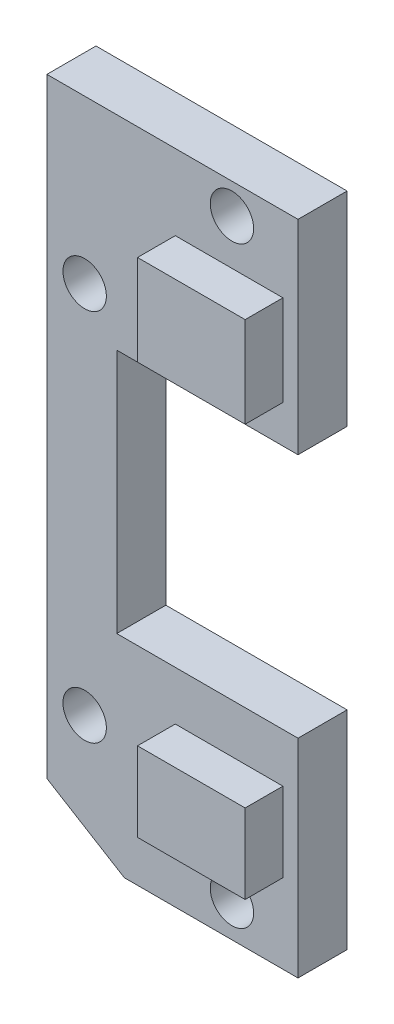
ISO-10303-21;
HEADER;
FILE_DESCRIPTION(('STEP AP214'),'2;1');
FILE_NAME('part.step','',(''),(''),'','','');
FILE_SCHEMA(('AUTOMOTIVE_DESIGN { 1 0 10303 214 1 1 1 1 }'));
ENDSEC;
DATA;
#1=APPLICATION_CONTEXT('core data for automotive mechanical design processes');
#2=APPLICATION_PROTOCOL_DEFINITION('international standard','automotive_design',2000,#1);
#3=PRODUCT_CONTEXT('',#1,'mechanical');
#4=PRODUCT('Part','Part','',(#3));
#5=PRODUCT_RELATED_PRODUCT_CATEGORY('part','',(#4));
#6=PRODUCT_DEFINITION_FORMATION('','',#4);
#7=PRODUCT_DEFINITION_CONTEXT('part definition',#1,'design');
#8=PRODUCT_DEFINITION('design','',#6,#7);
#9=PRODUCT_DEFINITION_SHAPE('','',#8);
#10=(LENGTH_UNIT() NAMED_UNIT(*) SI_UNIT(.MILLI.,.METRE.));
#11=(NAMED_UNIT(*) PLANE_ANGLE_UNIT() SI_UNIT($,.RADIAN.));
#12=(NAMED_UNIT(*) SI_UNIT($,.STERADIAN.) SOLID_ANGLE_UNIT());
#13=UNCERTAINTY_MEASURE_WITH_UNIT(LENGTH_MEASURE(1.E-05),#10,'distance_accuracy_value','');
#14=(GEOMETRIC_REPRESENTATION_CONTEXT(3) GLOBAL_UNCERTAINTY_ASSIGNED_CONTEXT((#13)) GLOBAL_UNIT_ASSIGNED_CONTEXT((#10,
#11,#12)) REPRESENTATION_CONTEXT('',''));
#15=CARTESIAN_POINT('',(0.,0.,0.));
#16=DIRECTION('',(0.,0.,1.));
#17=DIRECTION('',(1.,0.,0.));
#18=AXIS2_PLACEMENT_3D('',#15,#16,#17);
#19=CARTESIAN_POINT('',(0.,0.,2.6));
#20=DIRECTION('',(0.,0.,1.));
#21=DIRECTION('',(1.,0.,0.));
#22=AXIS2_PLACEMENT_3D('',#19,#20,#21);
#23=PLANE('',#22);
#24=CARTESIAN_POINT('',(-29.,-22.2,2.6));
#25=DIRECTION('',(0.,0.,1.));
#26=DIRECTION('',(1.,0.,0.));
#27=AXIS2_PLACEMENT_3D('',#24,#25,#26);
#28=CIRCLE('',#27,1.15);
#29=CARTESIAN_POINT('',(-27.85,-22.2,2.6));
#30=VERTEX_POINT('',#29);
#31=EDGE_CURVE('E228',#30,#30,#28,.T.);
#32=ORIENTED_EDGE('',*,*,#31,.F.);
#33=EDGE_LOOP('',(#32));
#34=FACE_BOUND('',#33,.T.);
#35=CARTESIAN_POINT('',(-36.8,-17.6,2.6));
#36=DIRECTION('',(0.,0.,1.));
#37=DIRECTION('',(1.,0.,0.));
#38=AXIS2_PLACEMENT_3D('',#35,#36,#37);
#39=CIRCLE('',#38,1.15);
#40=CARTESIAN_POINT('',(-35.65,-17.6,2.6));
#41=VERTEX_POINT('',#40);
#42=EDGE_CURVE('E240',#41,#41,#39,.T.);
#43=ORIENTED_EDGE('',*,*,#42,.F.);
#44=EDGE_LOOP('',(#43));
#45=FACE_BOUND('',#44,.T.);
#46=DIRECTION('',(0.,-1.,0.));
#47=VECTOR('',#46,1.);
#48=CARTESIAN_POINT('',(-38.8,10.8,2.6));
#49=LINE('',#48,#47);
#50=CARTESIAN_POINT('',(-38.8,10.8,2.6));
#51=VERTEX_POINT('',#50);
#52=CARTESIAN_POINT('',(-38.8,-21.5,2.6));
#53=VERTEX_POINT('',#52);
#54=EDGE_CURVE('E246',#51,#53,#49,.T.);
#55=ORIENTED_EDGE('',*,*,#54,.T.);
#56=DIRECTION('',(0.853796175794035,-0.520607424264657,0.));
#57=VECTOR('',#56,1.);
#58=CARTESIAN_POINT('',(-38.8,-21.5,2.6));
#59=LINE('',#58,#57);
#60=CARTESIAN_POINT('',(-34.7,-24.,2.6));
#61=VERTEX_POINT('',#60);
#62=EDGE_CURVE('E249',#53,#61,#59,.T.);
#63=ORIENTED_EDGE('',*,*,#62,.T.);
#64=DIRECTION('',(1.,0.,0.));
#65=VECTOR('',#64,1.);
#66=CARTESIAN_POINT('',(-34.7,-24.,2.6));
#67=LINE('',#66,#65);
#68=CARTESIAN_POINT('',(-25.5,-24.,2.6));
#69=VERTEX_POINT('',#68);
#70=EDGE_CURVE('E252',#61,#69,#67,.T.);
#71=ORIENTED_EDGE('',*,*,#70,.T.);
#72=DIRECTION('',(0.,1.,0.));
#73=VECTOR('',#72,1.);
#74=CARTESIAN_POINT('',(-25.5,-24.,2.6));
#75=LINE('',#74,#73);
#76=CARTESIAN_POINT('',(-25.5,-13.,2.6));
#77=VERTEX_POINT('',#76);
#78=EDGE_CURVE('E254',#69,#77,#75,.T.);
#79=ORIENTED_EDGE('',*,*,#78,.T.);
#80=DIRECTION('',(-1.,0.,0.));
#81=VECTOR('',#80,1.);
#82=CARTESIAN_POINT('',(-25.5,-13.,2.6));
#83=LINE('',#82,#81);
#84=CARTESIAN_POINT('',(-35.1,-13.,2.6));
#85=VERTEX_POINT('',#84);
#86=EDGE_CURVE('E256',#77,#85,#83,.T.);
#87=ORIENTED_EDGE('',*,*,#86,.T.);
#88=DIRECTION('',(0.,1.,0.));
#89=VECTOR('',#88,1.);
#90=CARTESIAN_POINT('',(-35.1,-13.,2.6));
#91=LINE('',#90,#89);
#92=CARTESIAN_POINT('',(-35.1,0.,2.6));
#93=VERTEX_POINT('',#92);
#94=EDGE_CURVE('E258',#85,#93,#91,.T.);
#95=ORIENTED_EDGE('',*,*,#94,.T.);
#96=DIRECTION('',(1.,0.,0.));
#97=VECTOR('',#96,1.);
#98=CARTESIAN_POINT('',(-35.1,0.,2.6));
#99=LINE('',#98,#97);
#100=CARTESIAN_POINT('',(-25.5,0.,2.6));
#101=VERTEX_POINT('',#100);
#102=EDGE_CURVE('E260',#93,#101,#99,.T.);
#103=ORIENTED_EDGE('',*,*,#102,.T.);
#104=DIRECTION('',(0.,1.,0.));
#105=VECTOR('',#104,1.);
#106=CARTESIAN_POINT('',(-25.5,0.,2.6));
#107=LINE('',#106,#105);
#108=CARTESIAN_POINT('',(-25.5,10.8,2.6));
#109=VERTEX_POINT('',#108);
#110=EDGE_CURVE('E262',#101,#109,#107,.T.);
#111=ORIENTED_EDGE('',*,*,#110,.T.);
#112=DIRECTION('',(-1.,0.,0.));
#113=VECTOR('',#112,1.);
#114=CARTESIAN_POINT('',(-25.5,10.8,2.6));
#115=LINE('',#114,#113);
#116=EDGE_CURVE('E264',#109,#51,#115,.T.);
#117=ORIENTED_EDGE('',*,*,#116,.T.);
#118=EDGE_LOOP('',(#55,#63,#71,#79,#87,#95,#103,#111,#117));
#119=FACE_BOUND('',#118,.T.);
#120=CARTESIAN_POINT('',(-36.8,2.2,2.6));
#121=DIRECTION('',(0.,0.,1.));
#122=DIRECTION('',(1.,0.,0.));
#123=AXIS2_PLACEMENT_3D('',#120,#121,#122);
#124=CIRCLE('',#123,1.15);
#125=CARTESIAN_POINT('',(-35.65,2.2,2.6));
#126=VERTEX_POINT('',#125);
#127=EDGE_CURVE('E234',#126,#126,#124,.T.);
#128=ORIENTED_EDGE('',*,*,#127,.F.);
#129=EDGE_LOOP('',(#128));
#130=FACE_BOUND('',#129,.T.);
#131=CARTESIAN_POINT('',(-29.,9.2,2.6));
#132=DIRECTION('',(0.,0.,1.));
#133=DIRECTION('',(1.,0.,0.));
#134=AXIS2_PLACEMENT_3D('',#131,#132,#133);
#135=CIRCLE('',#134,1.15);
#136=CARTESIAN_POINT('',(-27.85,9.2,2.6));
#137=VERTEX_POINT('',#136);
#138=EDGE_CURVE('E222',#137,#137,#135,.T.);
#139=ORIENTED_EDGE('',*,*,#138,.F.);
#140=EDGE_LOOP('',(#139));
#141=FACE_BOUND('',#140,.T.);
#142=DIRECTION('',(1.,0.,0.));
#143=VECTOR('',#142,1.);
#144=CARTESIAN_POINT('',(-32.,-19.8,2.6));
#145=LINE('',#144,#143);
#146=CARTESIAN_POINT('',(-32.,-19.8,2.6));
#147=VERTEX_POINT('',#146);
#148=CARTESIAN_POINT('',(-26.3,-19.8,2.6));
#149=VERTEX_POINT('',#148);
#150=EDGE_CURVE('E187',#147,#149,#145,.T.);
#151=ORIENTED_EDGE('',*,*,#150,.F.);
#152=DIRECTION('',(0.,-1.,0.));
#153=VECTOR('',#152,1.);
#154=CARTESIAN_POINT('',(-32.,-15.6,2.6));
#155=LINE('',#154,#153);
#156=CARTESIAN_POINT('',(-32.,-15.6,2.6));
#157=VERTEX_POINT('',#156);
#158=EDGE_CURVE('E184',#157,#147,#155,.T.);
#159=ORIENTED_EDGE('',*,*,#158,.F.);
#160=DIRECTION('',(-1.,0.,0.));
#161=VECTOR('',#160,1.);
#162=CARTESIAN_POINT('',(-26.3,-15.6,2.6));
#163=LINE('',#162,#161);
#164=CARTESIAN_POINT('',(-26.3,-15.6,2.6));
#165=VERTEX_POINT('',#164);
#166=EDGE_CURVE('E202',#165,#157,#163,.T.);
#167=ORIENTED_EDGE('',*,*,#166,.F.);
#168=DIRECTION('',(0.,1.,0.));
#169=VECTOR('',#168,1.);
#170=CARTESIAN_POINT('',(-26.3,-19.8,2.6));
#171=LINE('',#170,#169);
#172=EDGE_CURVE('E210',#149,#165,#171,.T.);
#173=ORIENTED_EDGE('',*,*,#172,.F.);
#174=EDGE_LOOP('',(#151,#159,#167,#173));
#175=FACE_BOUND('',#174,.T.);
#176=DIRECTION('',(1.,0.,0.));
#177=VECTOR('',#176,1.);
#178=CARTESIAN_POINT('',(-32.,2.,2.6));
#179=LINE('',#178,#177);
#180=CARTESIAN_POINT('',(-32.,2.,2.6));
#181=VERTEX_POINT('',#180);
#182=CARTESIAN_POINT('',(-26.3,2.,2.6));
#183=VERTEX_POINT('',#182);
#184=EDGE_CURVE('E183',#181,#183,#179,.T.);
#185=ORIENTED_EDGE('',*,*,#184,.F.);
#186=DIRECTION('',(0.,-1.,0.));
#187=VECTOR('',#186,1.);
#188=CARTESIAN_POINT('',(-32.,6.8,2.6));
#189=LINE('',#188,#187);
#190=CARTESIAN_POINT('',(-32.,6.8,2.6));
#191=VERTEX_POINT('',#190);
#192=EDGE_CURVE('E178',#191,#181,#189,.T.);
#193=ORIENTED_EDGE('',*,*,#192,.F.);
#194=DIRECTION('',(-1.,0.,0.));
#195=VECTOR('',#194,1.);
#196=CARTESIAN_POINT('',(-26.3,6.8,2.6));
#197=LINE('',#196,#195);
#198=CARTESIAN_POINT('',(-26.3,6.8,2.6));
#199=VERTEX_POINT('',#198);
#200=EDGE_CURVE('E163',#199,#191,#197,.T.);
#201=ORIENTED_EDGE('',*,*,#200,.F.);
#202=DIRECTION('',(0.,1.,0.));
#203=VECTOR('',#202,1.);
#204=CARTESIAN_POINT('',(-26.3,2.,2.6));
#205=LINE('',#204,#203);
#206=EDGE_CURVE('E171',#183,#199,#205,.T.);
#207=ORIENTED_EDGE('',*,*,#206,.F.);
#208=EDGE_LOOP('',(#185,#193,#201,#207));
#209=FACE_BOUND('',#208,.T.);
#210=ADVANCED_FACE('F43',(#34,#45,#119,#130,#141,#175,#209),#23,.T.);
#211=CARTESIAN_POINT('',(0.,0.,0.));
#212=DIRECTION('',(0.,0.,1.));
#213=DIRECTION('',(1.,0.,0.));
#214=AXIS2_PLACEMENT_3D('',#211,#212,#213);
#215=PLANE('',#214);
#216=DIRECTION('',(0.,-1.,0.));
#217=VECTOR('',#216,1.);
#218=CARTESIAN_POINT('',(-38.8,10.8,0.));
#219=LINE('',#218,#217);
#220=CARTESIAN_POINT('',(-38.8,10.8,0.));
#221=VERTEX_POINT('',#220);
#222=CARTESIAN_POINT('',(-38.8,-21.5,0.));
#223=VERTEX_POINT('',#222);
#224=EDGE_CURVE('E243',#221,#223,#219,.T.);
#225=ORIENTED_EDGE('',*,*,#224,.F.);
#226=DIRECTION('',(-1.,0.,0.));
#227=VECTOR('',#226,1.);
#228=CARTESIAN_POINT('',(-25.5,10.8,0.));
#229=LINE('',#228,#227);
#230=CARTESIAN_POINT('',(-25.5,10.8,0.));
#231=VERTEX_POINT('',#230);
#232=EDGE_CURVE('E250',#231,#221,#229,.T.);
#233=ORIENTED_EDGE('',*,*,#232,.F.);
#234=DIRECTION('',(0.,1.,0.));
#235=VECTOR('',#234,1.);
#236=CARTESIAN_POINT('',(-25.5,0.,0.));
#237=LINE('',#236,#235);
#238=CARTESIAN_POINT('',(-25.5,0.,0.));
#239=VERTEX_POINT('',#238);
#240=EDGE_CURVE('E281',#239,#231,#237,.T.);
#241=ORIENTED_EDGE('',*,*,#240,.F.);
#242=DIRECTION('',(1.,0.,0.));
#243=VECTOR('',#242,1.);
#244=CARTESIAN_POINT('',(-35.1,0.,0.));
#245=LINE('',#244,#243);
#246=CARTESIAN_POINT('',(-35.1,0.,0.));
#247=VERTEX_POINT('',#246);
#248=EDGE_CURVE('E279',#247,#239,#245,.T.);
#249=ORIENTED_EDGE('',*,*,#248,.F.);
#250=DIRECTION('',(0.,1.,0.));
#251=VECTOR('',#250,1.);
#252=CARTESIAN_POINT('',(-35.1,-13.,0.));
#253=LINE('',#252,#251);
#254=CARTESIAN_POINT('',(-35.1,-13.,0.));
#255=VERTEX_POINT('',#254);
#256=EDGE_CURVE('E277',#255,#247,#253,.T.);
#257=ORIENTED_EDGE('',*,*,#256,.F.);
#258=DIRECTION('',(-1.,0.,0.));
#259=VECTOR('',#258,1.);
#260=CARTESIAN_POINT('',(-25.5,-13.,0.));
#261=LINE('',#260,#259);
#262=CARTESIAN_POINT('',(-25.5,-13.,0.));
#263=VERTEX_POINT('',#262);
#264=EDGE_CURVE('E275',#263,#255,#261,.T.);
#265=ORIENTED_EDGE('',*,*,#264,.F.);
#266=DIRECTION('',(0.,1.,0.));
#267=VECTOR('',#266,1.);
#268=CARTESIAN_POINT('',(-25.5,-24.,0.));
#269=LINE('',#268,#267);
#270=CARTESIAN_POINT('',(-25.5,-24.,0.));
#271=VERTEX_POINT('',#270);
#272=EDGE_CURVE('E273',#271,#263,#269,.T.);
#273=ORIENTED_EDGE('',*,*,#272,.F.);
#274=DIRECTION('',(1.,0.,0.));
#275=VECTOR('',#274,1.);
#276=CARTESIAN_POINT('',(-34.7,-24.,0.));
#277=LINE('',#276,#275);
#278=CARTESIAN_POINT('',(-34.7,-24.,0.));
#279=VERTEX_POINT('',#278);
#280=EDGE_CURVE('E271',#279,#271,#277,.T.);
#281=ORIENTED_EDGE('',*,*,#280,.F.);
#282=DIRECTION('',(0.853796175794035,-0.520607424264657,0.));
#283=VECTOR('',#282,1.);
#284=CARTESIAN_POINT('',(-38.8,-21.5,0.));
#285=LINE('',#284,#283);
#286=EDGE_CURVE('E269',#223,#279,#285,.T.);
#287=ORIENTED_EDGE('',*,*,#286,.F.);
#288=EDGE_LOOP('',(#225,#233,#241,#249,#257,#265,#273,#281,#287));
#289=FACE_BOUND('',#288,.T.);
#290=CARTESIAN_POINT('',(-36.8,-17.6,0.));
#291=DIRECTION('',(0.,0.,1.));
#292=DIRECTION('',(1.,0.,0.));
#293=AXIS2_PLACEMENT_3D('',#290,#291,#292);
#294=CIRCLE('',#293,1.15);
#295=CARTESIAN_POINT('',(-35.65,-17.6,0.));
#296=VERTEX_POINT('',#295);
#297=EDGE_CURVE('E237',#296,#296,#294,.T.);
#298=ORIENTED_EDGE('',*,*,#297,.T.);
#299=EDGE_LOOP('',(#298));
#300=FACE_BOUND('',#299,.T.);
#301=CARTESIAN_POINT('',(-36.8,2.2,0.));
#302=DIRECTION('',(0.,0.,1.));
#303=DIRECTION('',(1.,0.,0.));
#304=AXIS2_PLACEMENT_3D('',#301,#302,#303);
#305=CIRCLE('',#304,1.15);
#306=CARTESIAN_POINT('',(-35.65,2.2,0.));
#307=VERTEX_POINT('',#306);
#308=EDGE_CURVE('E231',#307,#307,#305,.T.);
#309=ORIENTED_EDGE('',*,*,#308,.T.);
#310=EDGE_LOOP('',(#309));
#311=FACE_BOUND('',#310,.T.);
#312=CARTESIAN_POINT('',(-29.,-22.2,0.));
#313=DIRECTION('',(0.,0.,1.));
#314=DIRECTION('',(1.,0.,0.));
#315=AXIS2_PLACEMENT_3D('',#312,#313,#314);
#316=CIRCLE('',#315,1.15);
#317=CARTESIAN_POINT('',(-27.85,-22.2,0.));
#318=VERTEX_POINT('',#317);
#319=EDGE_CURVE('E225',#318,#318,#316,.T.);
#320=ORIENTED_EDGE('',*,*,#319,.T.);
#321=EDGE_LOOP('',(#320));
#322=FACE_BOUND('',#321,.T.);
#323=CARTESIAN_POINT('',(-29.,9.2,0.));
#324=DIRECTION('',(0.,0.,1.));
#325=DIRECTION('',(1.,0.,0.));
#326=AXIS2_PLACEMENT_3D('',#323,#324,#325);
#327=CIRCLE('',#326,1.15);
#328=CARTESIAN_POINT('',(-27.85,9.2,0.));
#329=VERTEX_POINT('',#328);
#330=EDGE_CURVE('E221',#329,#329,#327,.T.);
#331=ORIENTED_EDGE('',*,*,#330,.T.);
#332=EDGE_LOOP('',(#331));
#333=FACE_BOUND('',#332,.T.);
#334=ADVANCED_FACE('F314',(#289,#300,#311,#322,#333),#215,.F.);
#335=CARTESIAN_POINT('',(-38.8,10.8,2.6));
#336=DIRECTION('',(1.,0.,0.));
#337=DIRECTION('',(0.,0.,-1.));
#338=AXIS2_PLACEMENT_3D('',#335,#336,#337);
#339=PLANE('',#338);
#340=ORIENTED_EDGE('',*,*,#224,.T.);
#341=DIRECTION('',(0.,0.,-1.));
#342=VECTOR('',#341,1.);
#343=CARTESIAN_POINT('',(-38.8,-21.5,2.6));
#344=LINE('',#343,#342);
#345=EDGE_CURVE('E11',#53,#223,#344,.T.);
#346=ORIENTED_EDGE('',*,*,#345,.F.);
#347=ORIENTED_EDGE('',*,*,#54,.F.);
#348=DIRECTION('',(0.,0.,-1.));
#349=VECTOR('',#348,1.);
#350=CARTESIAN_POINT('',(-38.8,10.8,2.6));
#351=LINE('',#350,#349);
#352=EDGE_CURVE('E266',#51,#221,#351,.T.);
#353=ORIENTED_EDGE('',*,*,#352,.T.);
#354=EDGE_LOOP('',(#340,#346,#347,#353));
#355=FACE_BOUND('',#354,.T.);
#356=ADVANCED_FACE('F45',(#355),#339,.F.);
#357=CARTESIAN_POINT('',(-38.8,-21.5,2.6));
#358=DIRECTION('',(0.520607424264657,0.853796175794035,0.));
#359=DIRECTION('',(-0.853796175794035,0.520607424264657,0.));
#360=AXIS2_PLACEMENT_3D('',#357,#358,#359);
#361=PLANE('',#360);
#362=ORIENTED_EDGE('',*,*,#286,.T.);
#363=DIRECTION('',(0.,0.,-1.));
#364=VECTOR('',#363,1.);
#365=CARTESIAN_POINT('',(-34.7,-24.,2.6));
#366=LINE('',#365,#364);
#367=EDGE_CURVE('E51',#61,#279,#366,.T.);
#368=ORIENTED_EDGE('',*,*,#367,.F.);
#369=ORIENTED_EDGE('',*,*,#62,.F.);
#370=ORIENTED_EDGE('',*,*,#345,.T.);
#371=EDGE_LOOP('',(#362,#368,#369,#370));
#372=FACE_BOUND('',#371,.T.);
#373=ADVANCED_FACE('F332',(#372),#361,.F.);
#374=CARTESIAN_POINT('',(-34.7,-24.,2.6));
#375=DIRECTION('',(0.,1.,0.));
#376=DIRECTION('',(0.,0.,1.));
#377=AXIS2_PLACEMENT_3D('',#374,#375,#376);
#378=PLANE('',#377);
#379=ORIENTED_EDGE('',*,*,#280,.T.);
#380=DIRECTION('',(0.,0.,-1.));
#381=VECTOR('',#380,1.);
#382=CARTESIAN_POINT('',(-25.5,-24.,2.6));
#383=LINE('',#382,#381);
#384=EDGE_CURVE('E301',#69,#271,#383,.T.);
#385=ORIENTED_EDGE('',*,*,#384,.F.);
#386=ORIENTED_EDGE('',*,*,#70,.F.);
#387=ORIENTED_EDGE('',*,*,#367,.T.);
#388=EDGE_LOOP('',(#379,#385,#386,#387));
#389=FACE_BOUND('',#388,.T.);
#390=ADVANCED_FACE('F308',(#389),#378,.F.);
#391=CARTESIAN_POINT('',(-25.5,-24.,2.6));
#392=DIRECTION('',(-1.,0.,0.));
#393=DIRECTION('',(0.,0.,1.));
#394=AXIS2_PLACEMENT_3D('',#391,#392,#393);
#395=PLANE('',#394);
#396=ORIENTED_EDGE('',*,*,#272,.T.);
#397=DIRECTION('',(0.,0.,-1.));
#398=VECTOR('',#397,1.);
#399=CARTESIAN_POINT('',(-25.5,-13.,2.6));
#400=LINE('',#399,#398);
#401=EDGE_CURVE('E298',#77,#263,#400,.T.);
#402=ORIENTED_EDGE('',*,*,#401,.F.);
#403=ORIENTED_EDGE('',*,*,#78,.F.);
#404=ORIENTED_EDGE('',*,*,#384,.T.);
#405=EDGE_LOOP('',(#396,#402,#403,#404));
#406=FACE_BOUND('',#405,.T.);
#407=ADVANCED_FACE('F320',(#406),#395,.F.);
#408=CARTESIAN_POINT('',(-25.5,-13.,2.6));
#409=DIRECTION('',(0.,-1.,0.));
#410=DIRECTION('',(0.,0.,-1.));
#411=AXIS2_PLACEMENT_3D('',#408,#409,#410);
#412=PLANE('',#411);
#413=ORIENTED_EDGE('',*,*,#264,.T.);
#414=DIRECTION('',(0.,0.,-1.));
#415=VECTOR('',#414,1.);
#416=CARTESIAN_POINT('',(-35.1,-13.,2.6));
#417=LINE('',#416,#415);
#418=EDGE_CURVE('E295',#85,#255,#417,.T.);
#419=ORIENTED_EDGE('',*,*,#418,.F.);
#420=ORIENTED_EDGE('',*,*,#86,.F.);
#421=ORIENTED_EDGE('',*,*,#401,.T.);
#422=EDGE_LOOP('',(#413,#419,#420,#421));
#423=FACE_BOUND('',#422,.T.);
#424=ADVANCED_FACE('F324',(#423),#412,.F.);
#425=CARTESIAN_POINT('',(-35.1,-13.,2.6));
#426=DIRECTION('',(-1.,0.,0.));
#427=DIRECTION('',(0.,0.,1.));
#428=AXIS2_PLACEMENT_3D('',#425,#426,#427);
#429=PLANE('',#428);
#430=ORIENTED_EDGE('',*,*,#256,.T.);
#431=DIRECTION('',(0.,0.,-1.));
#432=VECTOR('',#431,1.);
#433=CARTESIAN_POINT('',(-35.1,0.,2.6));
#434=LINE('',#433,#432);
#435=EDGE_CURVE('E292',#93,#247,#434,.T.);
#436=ORIENTED_EDGE('',*,*,#435,.F.);
#437=ORIENTED_EDGE('',*,*,#94,.F.);
#438=ORIENTED_EDGE('',*,*,#418,.T.);
#439=EDGE_LOOP('',(#430,#436,#437,#438));
#440=FACE_BOUND('',#439,.T.);
#441=ADVANCED_FACE('F350',(#440),#429,.F.);
#442=CARTESIAN_POINT('',(-35.1,0.,2.6));
#443=DIRECTION('',(0.,1.,0.));
#444=DIRECTION('',(0.,0.,1.));
#445=AXIS2_PLACEMENT_3D('',#442,#443,#444);
#446=PLANE('',#445);
#447=ORIENTED_EDGE('',*,*,#248,.T.);
#448=DIRECTION('',(0.,0.,-1.));
#449=VECTOR('',#448,1.);
#450=CARTESIAN_POINT('',(-25.5,0.,2.6));
#451=LINE('',#450,#449);
#452=EDGE_CURVE('E289',#101,#239,#451,.T.);
#453=ORIENTED_EDGE('',*,*,#452,.F.);
#454=ORIENTED_EDGE('',*,*,#102,.F.);
#455=ORIENTED_EDGE('',*,*,#435,.T.);
#456=EDGE_LOOP('',(#447,#453,#454,#455));
#457=FACE_BOUND('',#456,.T.);
#458=ADVANCED_FACE('F348',(#457),#446,.F.);
#459=CARTESIAN_POINT('',(-25.5,0.,2.6));
#460=DIRECTION('',(-1.,0.,0.));
#461=DIRECTION('',(0.,0.,1.));
#462=AXIS2_PLACEMENT_3D('',#459,#460,#461);
#463=PLANE('',#462);
#464=ORIENTED_EDGE('',*,*,#240,.T.);
#465=DIRECTION('',(0.,0.,-1.));
#466=VECTOR('',#465,1.);
#467=CARTESIAN_POINT('',(-25.5,10.8,2.6));
#468=LINE('',#467,#466);
#469=EDGE_CURVE('E286',#109,#231,#468,.T.);
#470=ORIENTED_EDGE('',*,*,#469,.F.);
#471=ORIENTED_EDGE('',*,*,#110,.F.);
#472=ORIENTED_EDGE('',*,*,#452,.T.);
#473=EDGE_LOOP('',(#464,#470,#471,#472));
#474=FACE_BOUND('',#473,.T.);
#475=ADVANCED_FACE('F344',(#474),#463,.F.);
#476=CARTESIAN_POINT('',(-25.5,10.8,2.6));
#477=DIRECTION('',(0.,-1.,0.));
#478=DIRECTION('',(0.,0.,-1.));
#479=AXIS2_PLACEMENT_3D('',#476,#477,#478);
#480=PLANE('',#479);
#481=ORIENTED_EDGE('',*,*,#232,.T.);
#482=ORIENTED_EDGE('',*,*,#352,.F.);
#483=ORIENTED_EDGE('',*,*,#116,.F.);
#484=ORIENTED_EDGE('',*,*,#469,.T.);
#485=EDGE_LOOP('',(#481,#482,#483,#484));
#486=FACE_BOUND('',#485,.T.);
#487=ADVANCED_FACE('F339',(#486),#480,.F.);
#488=CARTESIAN_POINT('',(-36.8,-17.6,2.6));
#489=DIRECTION('',(0.,0.,-1.));
#490=DIRECTION('',(-1.,0.,0.));
#491=AXIS2_PLACEMENT_3D('',#488,#489,#490);
#492=CYLINDRICAL_SURFACE('',#491,1.15);
#493=ORIENTED_EDGE('',*,*,#42,.T.);
#494=EDGE_LOOP('',(#493));
#495=FACE_BOUND('',#494,.T.);
#496=ORIENTED_EDGE('',*,*,#297,.F.);
#497=EDGE_LOOP('',(#496));
#498=FACE_BOUND('',#497,.T.);
#499=ADVANCED_FACE('F371',(#495,#498),#492,.F.);
#500=CARTESIAN_POINT('',(-36.8,2.2,2.6));
#501=DIRECTION('',(0.,0.,-1.));
#502=DIRECTION('',(-1.,0.,0.));
#503=AXIS2_PLACEMENT_3D('',#500,#501,#502);
#504=CYLINDRICAL_SURFACE('',#503,1.15);
#505=ORIENTED_EDGE('',*,*,#127,.T.);
#506=EDGE_LOOP('',(#505));
#507=FACE_BOUND('',#506,.T.);
#508=ORIENTED_EDGE('',*,*,#308,.F.);
#509=EDGE_LOOP('',(#508));
#510=FACE_BOUND('',#509,.T.);
#511=ADVANCED_FACE('F393',(#507,#510),#504,.F.);
#512=CARTESIAN_POINT('',(-29.,-22.2,2.6));
#513=DIRECTION('',(0.,0.,-1.));
#514=DIRECTION('',(-1.,0.,0.));
#515=AXIS2_PLACEMENT_3D('',#512,#513,#514);
#516=CYLINDRICAL_SURFACE('',#515,1.15);
#517=ORIENTED_EDGE('',*,*,#31,.T.);
#518=EDGE_LOOP('',(#517));
#519=FACE_BOUND('',#518,.T.);
#520=ORIENTED_EDGE('',*,*,#319,.F.);
#521=EDGE_LOOP('',(#520));
#522=FACE_BOUND('',#521,.T.);
#523=ADVANCED_FACE('F401',(#519,#522),#516,.F.);
#524=CARTESIAN_POINT('',(-29.,9.2,2.6));
#525=DIRECTION('',(0.,0.,-1.));
#526=DIRECTION('',(-1.,0.,0.));
#527=AXIS2_PLACEMENT_3D('',#524,#525,#526);
#528=CYLINDRICAL_SURFACE('',#527,1.15);
#529=ORIENTED_EDGE('',*,*,#138,.T.);
#530=EDGE_LOOP('',(#529));
#531=FACE_BOUND('',#530,.T.);
#532=ORIENTED_EDGE('',*,*,#330,.F.);
#533=EDGE_LOOP('',(#532));
#534=FACE_BOUND('',#533,.T.);
#535=ADVANCED_FACE('F408',(#531,#534),#528,.F.);
#536=CARTESIAN_POINT('',(-32.,-15.6,4.6));
#537=DIRECTION('',(1.,0.,0.));
#538=DIRECTION('',(0.,0.,-1.));
#539=AXIS2_PLACEMENT_3D('',#536,#537,#538);
#540=PLANE('',#539);
#541=ORIENTED_EDGE('',*,*,#158,.T.);
#542=DIRECTION('',(0.,0.,-1.));
#543=VECTOR('',#542,1.);
#544=CARTESIAN_POINT('',(-32.,-19.8,4.6));
#545=LINE('',#544,#543);
#546=CARTESIAN_POINT('',(-32.,-19.8,4.6));
#547=VERTEX_POINT('',#546);
#548=EDGE_CURVE('E219',#547,#147,#545,.T.);
#549=ORIENTED_EDGE('',*,*,#548,.F.);
#550=DIRECTION('',(0.,-1.,0.));
#551=VECTOR('',#550,1.);
#552=CARTESIAN_POINT('',(-32.,-15.6,4.6));
#553=LINE('',#552,#551);
#554=CARTESIAN_POINT('',(-32.,-15.6,4.6));
#555=VERTEX_POINT('',#554);
#556=EDGE_CURVE('E198',#555,#547,#553,.T.);
#557=ORIENTED_EDGE('',*,*,#556,.F.);
#558=DIRECTION('',(0.,0.,-1.));
#559=VECTOR('',#558,1.);
#560=CARTESIAN_POINT('',(-32.,-15.6,4.6));
#561=LINE('',#560,#559);
#562=EDGE_CURVE('E207',#555,#157,#561,.T.);
#563=ORIENTED_EDGE('',*,*,#562,.T.);
#564=EDGE_LOOP('',(#541,#549,#557,#563));
#565=FACE_BOUND('',#564,.T.);
#566=ADVANCED_FACE('F416',(#565),#540,.F.);
#567=CARTESIAN_POINT('',(-32.,-19.8,4.6));
#568=DIRECTION('',(0.,1.,0.));
#569=DIRECTION('',(0.,0.,1.));
#570=AXIS2_PLACEMENT_3D('',#567,#568,#569);
#571=PLANE('',#570);
#572=ORIENTED_EDGE('',*,*,#150,.T.);
#573=DIRECTION('',(0.,0.,-1.));
#574=VECTOR('',#573,1.);
#575=CARTESIAN_POINT('',(-26.3,-19.8,4.6));
#576=LINE('',#575,#574);
#577=CARTESIAN_POINT('',(-26.3,-19.8,4.6));
#578=VERTEX_POINT('',#577);
#579=EDGE_CURVE('E216',#578,#149,#576,.T.);
#580=ORIENTED_EDGE('',*,*,#579,.F.);
#581=DIRECTION('',(1.,0.,0.));
#582=VECTOR('',#581,1.);
#583=CARTESIAN_POINT('',(-32.,-19.8,4.6));
#584=LINE('',#583,#582);
#585=EDGE_CURVE('E201',#547,#578,#584,.T.);
#586=ORIENTED_EDGE('',*,*,#585,.F.);
#587=ORIENTED_EDGE('',*,*,#548,.T.);
#588=EDGE_LOOP('',(#572,#580,#586,#587));
#589=FACE_BOUND('',#588,.T.);
#590=ADVANCED_FACE('F432',(#589),#571,.F.);
#591=CARTESIAN_POINT('',(-26.3,-19.8,4.6));
#592=DIRECTION('',(-1.,0.,0.));
#593=DIRECTION('',(0.,0.,1.));
#594=AXIS2_PLACEMENT_3D('',#591,#592,#593);
#595=PLANE('',#594);
#596=ORIENTED_EDGE('',*,*,#172,.T.);
#597=DIRECTION('',(0.,0.,-1.));
#598=VECTOR('',#597,1.);
#599=CARTESIAN_POINT('',(-26.3,-15.6,4.6));
#600=LINE('',#599,#598);
#601=CARTESIAN_POINT('',(-26.3,-15.6,4.6));
#602=VERTEX_POINT('',#601);
#603=EDGE_CURVE('E66',#602,#165,#600,.T.);
#604=ORIENTED_EDGE('',*,*,#603,.F.);
#605=DIRECTION('',(0.,1.,0.));
#606=VECTOR('',#605,1.);
#607=CARTESIAN_POINT('',(-26.3,-19.8,4.6));
#608=LINE('',#607,#606);
#609=EDGE_CURVE('E204',#578,#602,#608,.T.);
#610=ORIENTED_EDGE('',*,*,#609,.F.);
#611=ORIENTED_EDGE('',*,*,#579,.T.);
#612=EDGE_LOOP('',(#596,#604,#610,#611));
#613=FACE_BOUND('',#612,.T.);
#614=ADVANCED_FACE('F442',(#613),#595,.F.);
#615=CARTESIAN_POINT('',(-26.3,-15.6,4.6));
#616=DIRECTION('',(0.,-1.,0.));
#617=DIRECTION('',(0.,0.,-1.));
#618=AXIS2_PLACEMENT_3D('',#615,#616,#617);
#619=PLANE('',#618);
#620=ORIENTED_EDGE('',*,*,#166,.T.);
#621=ORIENTED_EDGE('',*,*,#562,.F.);
#622=DIRECTION('',(-1.,0.,0.));
#623=VECTOR('',#622,1.);
#624=CARTESIAN_POINT('',(-26.3,-15.6,4.6));
#625=LINE('',#624,#623);
#626=EDGE_CURVE('E206',#602,#555,#625,.T.);
#627=ORIENTED_EDGE('',*,*,#626,.F.);
#628=ORIENTED_EDGE('',*,*,#603,.T.);
#629=EDGE_LOOP('',(#620,#621,#627,#628));
#630=FACE_BOUND('',#629,.T.);
#631=ADVANCED_FACE('F452',(#630),#619,.F.);
#632=CARTESIAN_POINT('',(0.,0.,4.6));
#633=DIRECTION('',(0.,0.,1.));
#634=DIRECTION('',(1.,0.,0.));
#635=AXIS2_PLACEMENT_3D('',#632,#633,#634);
#636=PLANE('',#635);
#637=ORIENTED_EDGE('',*,*,#556,.T.);
#638=ORIENTED_EDGE('',*,*,#585,.T.);
#639=ORIENTED_EDGE('',*,*,#609,.T.);
#640=ORIENTED_EDGE('',*,*,#626,.T.);
#641=EDGE_LOOP('',(#637,#638,#639,#640));
#642=FACE_BOUND('',#641,.T.);
#643=ADVANCED_FACE('F462',(#642),#636,.T.);
#644=CARTESIAN_POINT('',(-32.,6.8,4.6));
#645=DIRECTION('',(1.,0.,0.));
#646=DIRECTION('',(0.,0.,-1.));
#647=AXIS2_PLACEMENT_3D('',#644,#645,#646);
#648=PLANE('',#647);
#649=ORIENTED_EDGE('',*,*,#192,.T.);
#650=DIRECTION('',(0.,0.,-1.));
#651=VECTOR('',#650,1.);
#652=CARTESIAN_POINT('',(-32.,2.,4.6));
#653=LINE('',#652,#651);
#654=CARTESIAN_POINT('',(-32.,2.,4.6));
#655=VERTEX_POINT('',#654);
#656=EDGE_CURVE('E521',#655,#181,#653,.T.);
#657=ORIENTED_EDGE('',*,*,#656,.F.);
#658=DIRECTION('',(0.,-1.,0.));
#659=VECTOR('',#658,1.);
#660=CARTESIAN_POINT('',(-32.,6.8,4.6));
#661=LINE('',#660,#659);
#662=CARTESIAN_POINT('',(-32.,6.8,4.6));
#663=VERTEX_POINT('',#662);
#664=EDGE_CURVE('E172',#663,#655,#661,.T.);
#665=ORIENTED_EDGE('',*,*,#664,.F.);
#666=DIRECTION('',(0.,0.,-1.));
#667=VECTOR('',#666,1.);
#668=CARTESIAN_POINT('',(-32.,6.8,4.6));
#669=LINE('',#668,#667);
#670=EDGE_CURVE('E166',#663,#191,#669,.T.);
#671=ORIENTED_EDGE('',*,*,#670,.T.);
#672=EDGE_LOOP('',(#649,#657,#665,#671));
#673=FACE_BOUND('',#672,.T.);
#674=ADVANCED_FACE('F176',(#673),#648,.F.);
#675=CARTESIAN_POINT('',(-32.,2.,4.6));
#676=DIRECTION('',(0.,1.,0.));
#677=DIRECTION('',(0.,0.,1.));
#678=AXIS2_PLACEMENT_3D('',#675,#676,#677);
#679=PLANE('',#678);
#680=ORIENTED_EDGE('',*,*,#184,.T.);
#681=DIRECTION('',(0.,0.,-1.));
#682=VECTOR('',#681,1.);
#683=CARTESIAN_POINT('',(-26.3,2.,4.6));
#684=LINE('',#683,#682);
#685=CARTESIAN_POINT('',(-26.3,2.,4.6));
#686=VERTEX_POINT('',#685);
#687=EDGE_CURVE('E522',#686,#183,#684,.T.);
#688=ORIENTED_EDGE('',*,*,#687,.F.);
#689=DIRECTION('',(1.,0.,0.));
#690=VECTOR('',#689,1.);
#691=CARTESIAN_POINT('',(-32.,2.,4.6));
#692=LINE('',#691,#690);
#693=EDGE_CURVE('E195',#655,#686,#692,.T.);
#694=ORIENTED_EDGE('',*,*,#693,.F.);
#695=ORIENTED_EDGE('',*,*,#656,.T.);
#696=EDGE_LOOP('',(#680,#688,#694,#695));
#697=FACE_BOUND('',#696,.T.);
#698=ADVANCED_FACE('F480',(#697),#679,.F.);
#699=CARTESIAN_POINT('',(-26.3,2.,4.6));
#700=DIRECTION('',(-1.,0.,0.));
#701=DIRECTION('',(0.,0.,1.));
#702=AXIS2_PLACEMENT_3D('',#699,#700,#701);
#703=PLANE('',#702);
#704=ORIENTED_EDGE('',*,*,#206,.T.);
#705=DIRECTION('',(0.,0.,-1.));
#706=VECTOR('',#705,1.);
#707=CARTESIAN_POINT('',(-26.3,6.8,4.6));
#708=LINE('',#707,#706);
#709=CARTESIAN_POINT('',(-26.3,6.8,4.6));
#710=VERTEX_POINT('',#709);
#711=EDGE_CURVE('E58',#710,#199,#708,.T.);
#712=ORIENTED_EDGE('',*,*,#711,.F.);
#713=DIRECTION('',(0.,1.,0.));
#714=VECTOR('',#713,1.);
#715=CARTESIAN_POINT('',(-26.3,2.,4.6));
#716=LINE('',#715,#714);
#717=EDGE_CURVE('E193',#686,#710,#716,.T.);
#718=ORIENTED_EDGE('',*,*,#717,.F.);
#719=ORIENTED_EDGE('',*,*,#687,.T.);
#720=EDGE_LOOP('',(#704,#712,#718,#719));
#721=FACE_BOUND('',#720,.T.);
#722=ADVANCED_FACE('F489',(#721),#703,.F.);
#723=CARTESIAN_POINT('',(-26.3,6.8,4.6));
#724=DIRECTION('',(0.,-1.,0.));
#725=DIRECTION('',(0.,0.,-1.));
#726=AXIS2_PLACEMENT_3D('',#723,#724,#725);
#727=PLANE('',#726);
#728=ORIENTED_EDGE('',*,*,#200,.T.);
#729=ORIENTED_EDGE('',*,*,#670,.F.);
#730=DIRECTION('',(-1.,0.,0.));
#731=VECTOR('',#730,1.);
#732=CARTESIAN_POINT('',(-26.3,6.8,4.6));
#733=LINE('',#732,#731);
#734=EDGE_CURVE('E181',#710,#663,#733,.T.);
#735=ORIENTED_EDGE('',*,*,#734,.F.);
#736=ORIENTED_EDGE('',*,*,#711,.T.);
#737=EDGE_LOOP('',(#728,#729,#735,#736));
#738=FACE_BOUND('',#737,.T.);
#739=ADVANCED_FACE('F165',(#738),#727,.F.);
#740=CARTESIAN_POINT('',(0.,0.,4.6));
#741=DIRECTION('',(0.,0.,1.));
#742=DIRECTION('',(1.,0.,0.));
#743=AXIS2_PLACEMENT_3D('',#740,#741,#742);
#744=PLANE('',#743);
#745=ORIENTED_EDGE('',*,*,#664,.T.);
#746=ORIENTED_EDGE('',*,*,#693,.T.);
#747=ORIENTED_EDGE('',*,*,#717,.T.);
#748=ORIENTED_EDGE('',*,*,#734,.T.);
#749=EDGE_LOOP('',(#745,#746,#747,#748));
#750=FACE_BOUND('',#749,.T.);
#751=ADVANCED_FACE('F508',(#750),#744,.T.);
#752=CLOSED_SHELL('',(#210,#334,#356,#373,#390,#407,#424,#441,#458,#475,#487,#499,#511,#523,
#535,#566,#590,#614,#631,#643,#674,#698,#722,#739,#751));
#753=MANIFOLD_SOLID_BREP('B2',#752);
#754=ADVANCED_BREP_SHAPE_REPRESENTATION('',(#18,#753),#14);
#755=SHAPE_DEFINITION_REPRESENTATION(#9,#754);
ENDSEC;
END-ISO-10303-21;
